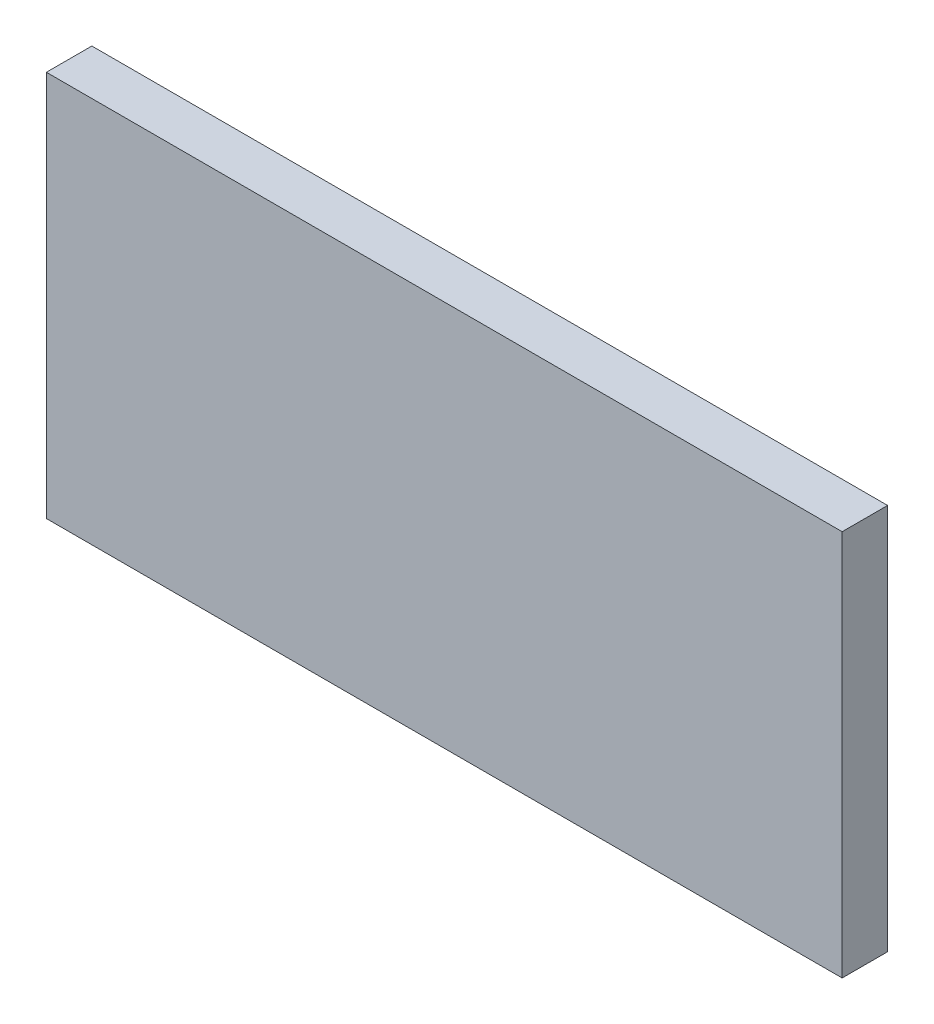
ISO-10303-21;
HEADER;
FILE_DESCRIPTION(('STEP AP214'),'2;1');
FILE_NAME('part.step','',(''),(''),'','','');
FILE_SCHEMA(('AUTOMOTIVE_DESIGN { 1 0 10303 214 1 1 1 1 }'));
ENDSEC;
DATA;
#1=APPLICATION_CONTEXT('core data for automotive mechanical design processes');
#2=APPLICATION_PROTOCOL_DEFINITION('international standard','automotive_design',2000,#1);
#3=PRODUCT_CONTEXT('',#1,'mechanical');
#4=PRODUCT('Part','Part','',(#3));
#5=PRODUCT_RELATED_PRODUCT_CATEGORY('part','',(#4));
#6=PRODUCT_DEFINITION_FORMATION('','',#4);
#7=PRODUCT_DEFINITION_CONTEXT('part definition',#1,'design');
#8=PRODUCT_DEFINITION('design','',#6,#7);
#9=PRODUCT_DEFINITION_SHAPE('','',#8);
#10=(LENGTH_UNIT() NAMED_UNIT(*) SI_UNIT(.MILLI.,.METRE.));
#11=(NAMED_UNIT(*) PLANE_ANGLE_UNIT() SI_UNIT($,.RADIAN.));
#12=(NAMED_UNIT(*) SI_UNIT($,.STERADIAN.) SOLID_ANGLE_UNIT());
#13=UNCERTAINTY_MEASURE_WITH_UNIT(LENGTH_MEASURE(1.E-05),#10,'distance_accuracy_value','');
#14=(GEOMETRIC_REPRESENTATION_CONTEXT(3) GLOBAL_UNCERTAINTY_ASSIGNED_CONTEXT((#13)) GLOBAL_UNIT_ASSIGNED_CONTEXT((#10,
#11,#12)) REPRESENTATION_CONTEXT('',''));
#15=CARTESIAN_POINT('',(0.,0.,0.));
#16=DIRECTION('',(0.,0.,1.));
#17=DIRECTION('',(1.,0.,0.));
#18=AXIS2_PLACEMENT_3D('',#15,#16,#17);
#19=CARTESIAN_POINT('',(0.,0.,20.));
#20=DIRECTION('',(1.,0.,0.));
#21=DIRECTION('',(0.,0.,-1.));
#22=AXIS2_PLACEMENT_3D('',#19,#20,#21);
#23=PLANE('',#22);
#24=DIRECTION('',(0.,-1.,0.));
#25=VECTOR('',#24,1.);
#26=CARTESIAN_POINT('',(0.,0.,0.));
#27=LINE('',#26,#25);
#28=CARTESIAN_POINT('',(0.,170.,0.));
#29=VERTEX_POINT('',#28);
#30=CARTESIAN_POINT('',(0.,0.,0.));
#31=VERTEX_POINT('',#30);
#32=EDGE_CURVE('E96',#29,#31,#27,.T.);
#33=ORIENTED_EDGE('',*,*,#32,.T.);
#34=DIRECTION('',(0.,0.,-1.));
#35=VECTOR('',#34,1.);
#36=CARTESIAN_POINT('',(0.,0.,20.));
#37=LINE('',#36,#35);
#38=CARTESIAN_POINT('',(0.,0.,20.));
#39=VERTEX_POINT('',#38);
#40=EDGE_CURVE('E11',#39,#31,#37,.T.);
#41=ORIENTED_EDGE('',*,*,#40,.F.);
#42=DIRECTION('',(0.,-1.,0.));
#43=VECTOR('',#42,1.);
#44=CARTESIAN_POINT('',(0.,0.,20.));
#45=LINE('',#44,#43);
#46=CARTESIAN_POINT('',(0.,170.,20.));
#47=VERTEX_POINT('',#46);
#48=EDGE_CURVE('E84',#47,#39,#45,.T.);
#49=ORIENTED_EDGE('',*,*,#48,.F.);
#50=DIRECTION('',(0.,0.,-1.));
#51=VECTOR('',#50,1.);
#52=CARTESIAN_POINT('',(0.,170.,20.));
#53=LINE('',#52,#51);
#54=EDGE_CURVE('E92',#47,#29,#53,.T.);
#55=ORIENTED_EDGE('',*,*,#54,.T.);
#56=EDGE_LOOP('',(#33,#41,#49,#55));
#57=FACE_BOUND('',#56,.T.);
#58=ADVANCED_FACE('F33',(#57),#23,.F.);
#59=CARTESIAN_POINT('',(0.,0.,20.));
#60=DIRECTION('',(0.,1.,0.));
#61=DIRECTION('',(0.,0.,1.));
#62=AXIS2_PLACEMENT_3D('',#59,#60,#61);
#63=PLANE('',#62);
#64=DIRECTION('',(1.,0.,0.));
#65=VECTOR('',#64,1.);
#66=CARTESIAN_POINT('',(0.,0.,0.));
#67=LINE('',#66,#65);
#68=CARTESIAN_POINT('',(350.,0.,0.));
#69=VERTEX_POINT('',#68);
#70=EDGE_CURVE('E88',#31,#69,#67,.T.);
#71=ORIENTED_EDGE('',*,*,#70,.T.);
#72=DIRECTION('',(0.,0.,-1.));
#73=VECTOR('',#72,1.);
#74=CARTESIAN_POINT('',(350.,0.,20.));
#75=LINE('',#74,#73);
#76=CARTESIAN_POINT('',(350.,0.,20.));
#77=VERTEX_POINT('',#76);
#78=EDGE_CURVE('E41',#77,#69,#75,.T.);
#79=ORIENTED_EDGE('',*,*,#78,.F.);
#80=DIRECTION('',(1.,0.,0.));
#81=VECTOR('',#80,1.);
#82=CARTESIAN_POINT('',(0.,0.,20.));
#83=LINE('',#82,#81);
#84=EDGE_CURVE('E79',#39,#77,#83,.T.);
#85=ORIENTED_EDGE('',*,*,#84,.F.);
#86=ORIENTED_EDGE('',*,*,#40,.T.);
#87=EDGE_LOOP('',(#71,#79,#85,#86));
#88=FACE_BOUND('',#87,.T.);
#89=ADVANCED_FACE('F87',(#88),#63,.F.);
#90=CARTESIAN_POINT('',(350.,0.,20.));
#91=DIRECTION('',(-1.,0.,0.));
#92=DIRECTION('',(0.,0.,1.));
#93=AXIS2_PLACEMENT_3D('',#90,#91,#92);
#94=PLANE('',#93);
#95=DIRECTION('',(0.,1.,0.));
#96=VECTOR('',#95,1.);
#97=CARTESIAN_POINT('',(350.,0.,0.));
#98=LINE('',#97,#96);
#99=CARTESIAN_POINT('',(350.,170.,0.));
#100=VERTEX_POINT('',#99);
#101=EDGE_CURVE('E66',#69,#100,#98,.T.);
#102=ORIENTED_EDGE('',*,*,#101,.T.);
#103=DIRECTION('',(0.,0.,-1.));
#104=VECTOR('',#103,1.);
#105=CARTESIAN_POINT('',(350.,170.,20.));
#106=LINE('',#105,#104);
#107=CARTESIAN_POINT('',(350.,170.,20.));
#108=VERTEX_POINT('',#107);
#109=EDGE_CURVE('E89',#108,#100,#106,.T.);
#110=ORIENTED_EDGE('',*,*,#109,.F.);
#111=DIRECTION('',(0.,1.,0.));
#112=VECTOR('',#111,1.);
#113=CARTESIAN_POINT('',(350.,0.,20.));
#114=LINE('',#113,#112);
#115=EDGE_CURVE('E82',#77,#108,#114,.T.);
#116=ORIENTED_EDGE('',*,*,#115,.F.);
#117=ORIENTED_EDGE('',*,*,#78,.T.);
#118=EDGE_LOOP('',(#102,#110,#116,#117));
#119=FACE_BOUND('',#118,.T.);
#120=ADVANCED_FACE('F90',(#119),#94,.F.);
#121=CARTESIAN_POINT('',(0.,170.,20.));
#122=DIRECTION('',(0.,-1.,0.));
#123=DIRECTION('',(0.,0.,-1.));
#124=AXIS2_PLACEMENT_3D('',#121,#122,#123);
#125=PLANE('',#124);
#126=DIRECTION('',(-1.,0.,0.));
#127=VECTOR('',#126,1.);
#128=CARTESIAN_POINT('',(0.,170.,0.));
#129=LINE('',#128,#127);
#130=EDGE_CURVE('E72',#100,#29,#129,.T.);
#131=ORIENTED_EDGE('',*,*,#130,.T.);
#132=ORIENTED_EDGE('',*,*,#54,.F.);
#133=DIRECTION('',(-1.,0.,0.));
#134=VECTOR('',#133,1.);
#135=CARTESIAN_POINT('',(0.,170.,20.));
#136=LINE('',#135,#134);
#137=EDGE_CURVE('E49',#108,#47,#136,.T.);
#138=ORIENTED_EDGE('',*,*,#137,.F.);
#139=ORIENTED_EDGE('',*,*,#109,.T.);
#140=EDGE_LOOP('',(#131,#132,#138,#139));
#141=FACE_BOUND('',#140,.T.);
#142=ADVANCED_FACE('F103',(#141),#125,.F.);
#143=CARTESIAN_POINT('',(0.,0.,20.));
#144=DIRECTION('',(0.,0.,-1.));
#145=DIRECTION('',(-1.,0.,0.));
#146=AXIS2_PLACEMENT_3D('',#143,#144,#145);
#147=PLANE('',#146);
#148=ORIENTED_EDGE('',*,*,#48,.T.);
#149=ORIENTED_EDGE('',*,*,#84,.T.);
#150=ORIENTED_EDGE('',*,*,#115,.T.);
#151=ORIENTED_EDGE('',*,*,#137,.T.);
#152=EDGE_LOOP('',(#148,#149,#150,#151));
#153=FACE_BOUND('',#152,.T.);
#154=ADVANCED_FACE('F80',(#153),#147,.F.);
#155=CARTESIAN_POINT('',(0.,0.,0.));
#156=DIRECTION('',(0.,0.,-1.));
#157=DIRECTION('',(-1.,0.,0.));
#158=AXIS2_PLACEMENT_3D('',#155,#156,#157);
#159=PLANE('',#158);
#160=ORIENTED_EDGE('',*,*,#32,.F.);
#161=ORIENTED_EDGE('',*,*,#130,.F.);
#162=ORIENTED_EDGE('',*,*,#101,.F.);
#163=ORIENTED_EDGE('',*,*,#70,.F.);
#164=EDGE_LOOP('',(#160,#161,#162,#163));
#165=FACE_BOUND('',#164,.T.);
#166=ADVANCED_FACE('F106',(#165),#159,.T.);
#167=CLOSED_SHELL('',(#58,#89,#120,#142,#154,#166));
#168=MANIFOLD_SOLID_BREP('B2',#167);
#169=ADVANCED_BREP_SHAPE_REPRESENTATION('',(#18,#168),#14);
#170=SHAPE_DEFINITION_REPRESENTATION(#9,#169);
ENDSEC;
END-ISO-10303-21;
